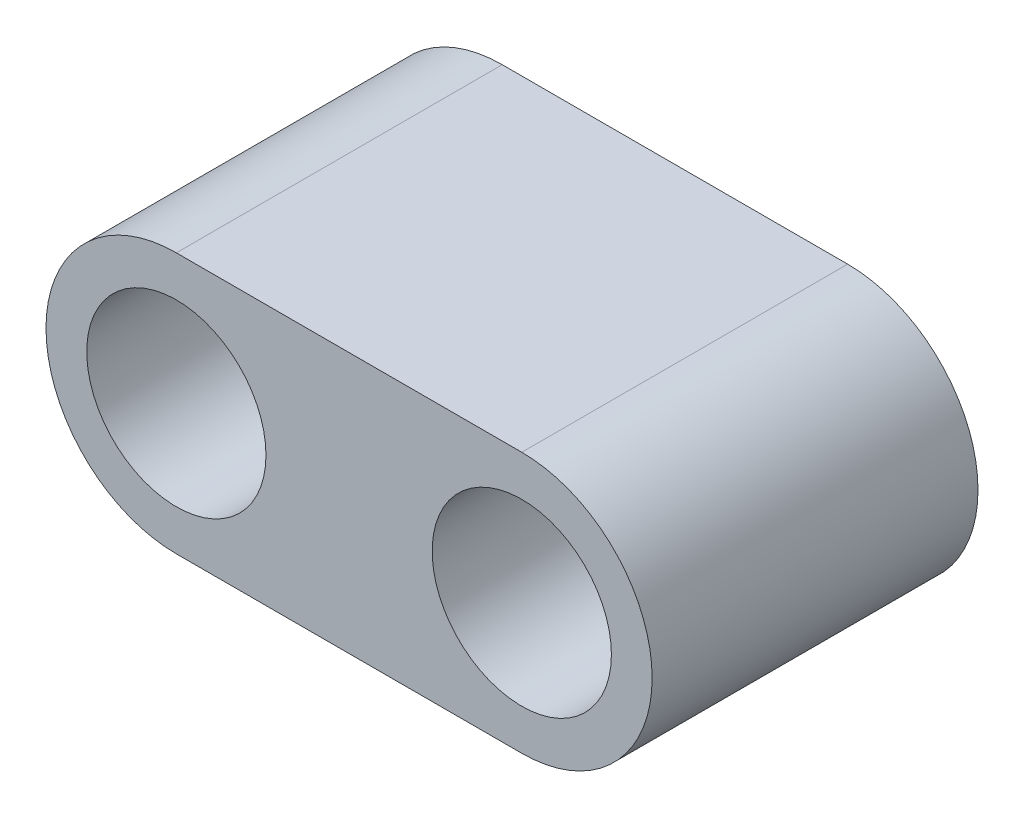
ISO-10303-21;
HEADER;
FILE_DESCRIPTION(('STEP AP214'),'2;1');
FILE_NAME('part.step','',(''),(''),'','','');
FILE_SCHEMA(('AUTOMOTIVE_DESIGN { 1 0 10303 214 1 1 1 1 }'));
ENDSEC;
DATA;
#1=APPLICATION_CONTEXT('core data for automotive mechanical design processes');
#2=APPLICATION_PROTOCOL_DEFINITION('international standard','automotive_design',2000,#1);
#3=PRODUCT_CONTEXT('',#1,'mechanical');
#4=PRODUCT('Part','Part','',(#3));
#5=PRODUCT_RELATED_PRODUCT_CATEGORY('part','',(#4));
#6=PRODUCT_DEFINITION_FORMATION('','',#4);
#7=PRODUCT_DEFINITION_CONTEXT('part definition',#1,'design');
#8=PRODUCT_DEFINITION('design','',#6,#7);
#9=PRODUCT_DEFINITION_SHAPE('','',#8);
#10=(LENGTH_UNIT() NAMED_UNIT(*) SI_UNIT(.MILLI.,.METRE.));
#11=(NAMED_UNIT(*) PLANE_ANGLE_UNIT() SI_UNIT($,.RADIAN.));
#12=(NAMED_UNIT(*) SI_UNIT($,.STERADIAN.) SOLID_ANGLE_UNIT());
#13=UNCERTAINTY_MEASURE_WITH_UNIT(LENGTH_MEASURE(1.E-05),#10,'distance_accuracy_value','');
#14=(GEOMETRIC_REPRESENTATION_CONTEXT(3) GLOBAL_UNCERTAINTY_ASSIGNED_CONTEXT((#13)) GLOBAL_UNIT_ASSIGNED_CONTEXT((#10,
#11,#12)) REPRESENTATION_CONTEXT('',''));
#15=CARTESIAN_POINT('',(0.,0.,0.));
#16=DIRECTION('',(0.,0.,1.));
#17=DIRECTION('',(1.,0.,0.));
#18=AXIS2_PLACEMENT_3D('',#15,#16,#17);
#19=CARTESIAN_POINT('',(0.,-10.,25.));
#20=DIRECTION('',(0.,0.,-1.));
#21=DIRECTION('',(-1.,0.,0.));
#22=AXIS2_PLACEMENT_3D('',#19,#20,#21);
#23=CYLINDRICAL_SURFACE('',#22,10.);
#24=CARTESIAN_POINT('',(0.,-10.,0.));
#25=DIRECTION('',(0.,0.,1.));
#26=DIRECTION('',(1.,0.,0.));
#27=AXIS2_PLACEMENT_3D('',#24,#25,#26);
#28=CIRCLE('',#27,10.);
#29=CARTESIAN_POINT('',(0.,0.,0.));
#30=VERTEX_POINT('',#29);
#31=CARTESIAN_POINT('',(0.,-20.,0.));
#32=VERTEX_POINT('',#31);
#33=EDGE_CURVE('E96',#30,#32,#28,.T.);
#34=ORIENTED_EDGE('',*,*,#33,.T.);
#35=DIRECTION('',(0.,0.,-1.));
#36=VECTOR('',#35,1.);
#37=CARTESIAN_POINT('',(0.,-20.,25.));
#38=LINE('',#37,#36);
#39=CARTESIAN_POINT('',(0.,-20.,25.));
#40=VERTEX_POINT('',#39);
#41=EDGE_CURVE('E11',#40,#32,#38,.T.);
#42=ORIENTED_EDGE('',*,*,#41,.F.);
#43=CARTESIAN_POINT('',(0.,-10.,25.));
#44=DIRECTION('',(0.,0.,1.));
#45=DIRECTION('',(1.,0.,0.));
#46=AXIS2_PLACEMENT_3D('',#43,#44,#45);
#47=CIRCLE('',#46,10.);
#48=CARTESIAN_POINT('',(0.,0.,25.));
#49=VERTEX_POINT('',#48);
#50=EDGE_CURVE('E84',#49,#40,#47,.T.);
#51=ORIENTED_EDGE('',*,*,#50,.F.);
#52=DIRECTION('',(0.,0.,-1.));
#53=VECTOR('',#52,1.);
#54=CARTESIAN_POINT('',(0.,0.,25.));
#55=LINE('',#54,#53);
#56=EDGE_CURVE('E92',#49,#30,#55,.T.);
#57=ORIENTED_EDGE('',*,*,#56,.T.);
#58=EDGE_LOOP('',(#34,#42,#51,#57));
#59=FACE_BOUND('',#58,.T.);
#60=ADVANCED_FACE('F33',(#59),#23,.T.);
#61=CARTESIAN_POINT('',(0.,-20.,25.));
#62=DIRECTION('',(0.,1.,0.));
#63=DIRECTION('',(0.,0.,1.));
#64=AXIS2_PLACEMENT_3D('',#61,#62,#63);
#65=PLANE('',#64);
#66=DIRECTION('',(1.,0.,0.));
#67=VECTOR('',#66,1.);
#68=CARTESIAN_POINT('',(0.,-20.,0.));
#69=LINE('',#68,#67);
#70=CARTESIAN_POINT('',(26.5,-20.,0.));
#71=VERTEX_POINT('',#70);
#72=EDGE_CURVE('E88',#32,#71,#69,.T.);
#73=ORIENTED_EDGE('',*,*,#72,.T.);
#74=DIRECTION('',(0.,0.,-1.));
#75=VECTOR('',#74,1.);
#76=CARTESIAN_POINT('',(26.5,-20.,25.));
#77=LINE('',#76,#75);
#78=CARTESIAN_POINT('',(26.5,-20.,25.));
#79=VERTEX_POINT('',#78);
#80=EDGE_CURVE('E41',#79,#71,#77,.T.);
#81=ORIENTED_EDGE('',*,*,#80,.F.);
#82=DIRECTION('',(1.,0.,0.));
#83=VECTOR('',#82,1.);
#84=CARTESIAN_POINT('',(0.,-20.,25.));
#85=LINE('',#84,#83);
#86=EDGE_CURVE('E79',#40,#79,#85,.T.);
#87=ORIENTED_EDGE('',*,*,#86,.F.);
#88=ORIENTED_EDGE('',*,*,#41,.T.);
#89=EDGE_LOOP('',(#73,#81,#87,#88));
#90=FACE_BOUND('',#89,.T.);
#91=ADVANCED_FACE('F87',(#90),#65,.F.);
#92=CARTESIAN_POINT('',(26.5,-10.,25.));
#93=DIRECTION('',(0.,0.,-1.));
#94=DIRECTION('',(-1.,0.,0.));
#95=AXIS2_PLACEMENT_3D('',#92,#93,#94);
#96=CYLINDRICAL_SURFACE('',#95,10.);
#97=CARTESIAN_POINT('',(26.5,-10.,0.));
#98=DIRECTION('',(0.,0.,1.));
#99=DIRECTION('',(-1.,0.,0.));
#100=AXIS2_PLACEMENT_3D('',#97,#98,#99);
#101=CIRCLE('',#100,10.);
#102=CARTESIAN_POINT('',(26.5,0.,0.));
#103=VERTEX_POINT('',#102);
#104=EDGE_CURVE('E66',#71,#103,#101,.T.);
#105=ORIENTED_EDGE('',*,*,#104,.T.);
#106=DIRECTION('',(0.,0.,-1.));
#107=VECTOR('',#106,1.);
#108=CARTESIAN_POINT('',(26.5,0.,25.));
#109=LINE('',#108,#107);
#110=CARTESIAN_POINT('',(26.5,0.,25.));
#111=VERTEX_POINT('',#110);
#112=EDGE_CURVE('E89',#111,#103,#109,.T.);
#113=ORIENTED_EDGE('',*,*,#112,.F.);
#114=CARTESIAN_POINT('',(26.5,-10.,25.));
#115=DIRECTION('',(0.,0.,1.));
#116=DIRECTION('',(-1.,0.,0.));
#117=AXIS2_PLACEMENT_3D('',#114,#115,#116);
#118=CIRCLE('',#117,10.);
#119=EDGE_CURVE('E82',#79,#111,#118,.T.);
#120=ORIENTED_EDGE('',*,*,#119,.F.);
#121=ORIENTED_EDGE('',*,*,#80,.T.);
#122=EDGE_LOOP('',(#105,#113,#120,#121));
#123=FACE_BOUND('',#122,.T.);
#124=ADVANCED_FACE('F90',(#123),#96,.T.);
#125=CARTESIAN_POINT('',(0.,0.,25.));
#126=DIRECTION('',(0.,-1.,0.));
#127=DIRECTION('',(0.,0.,-1.));
#128=AXIS2_PLACEMENT_3D('',#125,#126,#127);
#129=PLANE('',#128);
#130=DIRECTION('',(-1.,0.,0.));
#131=VECTOR('',#130,1.);
#132=CARTESIAN_POINT('',(0.,0.,0.));
#133=LINE('',#132,#131);
#134=EDGE_CURVE('E72',#103,#30,#133,.T.);
#135=ORIENTED_EDGE('',*,*,#134,.T.);
#136=ORIENTED_EDGE('',*,*,#56,.F.);
#137=DIRECTION('',(-1.,0.,0.));
#138=VECTOR('',#137,1.);
#139=CARTESIAN_POINT('',(0.,0.,25.));
#140=LINE('',#139,#138);
#141=EDGE_CURVE('E49',#111,#49,#140,.T.);
#142=ORIENTED_EDGE('',*,*,#141,.F.);
#143=ORIENTED_EDGE('',*,*,#112,.T.);
#144=EDGE_LOOP('',(#135,#136,#142,#143));
#145=FACE_BOUND('',#144,.T.);
#146=ADVANCED_FACE('F104',(#145),#129,.F.);
#147=CARTESIAN_POINT('',(0.,-10.,25.));
#148=DIRECTION('',(0.,0.,1.));
#149=DIRECTION('',(1.,0.,0.));
#150=AXIS2_PLACEMENT_3D('',#147,#148,#149);
#151=PLANE('',#150);
#152=CARTESIAN_POINT('',(0.,-10.,25.));
#153=DIRECTION('',(0.,0.,1.));
#154=DIRECTION('',(1.,0.,0.));
#155=AXIS2_PLACEMENT_3D('',#152,#153,#154);
#156=CIRCLE('',#155,6.875);
#157=CARTESIAN_POINT('',(6.875,-10.,25.));
#158=VERTEX_POINT('',#157);
#159=EDGE_CURVE('E116',#158,#158,#156,.T.);
#160=ORIENTED_EDGE('',*,*,#159,.F.);
#161=EDGE_LOOP('',(#160));
#162=FACE_BOUND('',#161,.T.);
#163=CARTESIAN_POINT('',(26.5,-10.,25.));
#164=DIRECTION('',(0.,0.,1.));
#165=DIRECTION('',(1.,0.,0.));
#166=AXIS2_PLACEMENT_3D('',#163,#164,#165);
#167=CIRCLE('',#166,6.875);
#168=CARTESIAN_POINT('',(33.375,-10.,25.));
#169=VERTEX_POINT('',#168);
#170=EDGE_CURVE('E110',#169,#169,#167,.T.);
#171=ORIENTED_EDGE('',*,*,#170,.F.);
#172=EDGE_LOOP('',(#171));
#173=FACE_BOUND('',#172,.T.);
#174=ORIENTED_EDGE('',*,*,#50,.T.);
#175=ORIENTED_EDGE('',*,*,#86,.T.);
#176=ORIENTED_EDGE('',*,*,#119,.T.);
#177=ORIENTED_EDGE('',*,*,#141,.T.);
#178=EDGE_LOOP('',(#174,#175,#176,#177));
#179=FACE_BOUND('',#178,.T.);
#180=ADVANCED_FACE('F80',(#162,#173,#179),#151,.T.);
#181=CARTESIAN_POINT('',(0.,-10.,0.));
#182=DIRECTION('',(0.,0.,1.));
#183=DIRECTION('',(1.,0.,0.));
#184=AXIS2_PLACEMENT_3D('',#181,#182,#183);
#185=PLANE('',#184);
#186=CARTESIAN_POINT('',(0.,-10.,0.));
#187=DIRECTION('',(0.,0.,1.));
#188=DIRECTION('',(1.,0.,0.));
#189=AXIS2_PLACEMENT_3D('',#186,#187,#188);
#190=CIRCLE('',#189,6.875);
#191=CARTESIAN_POINT('',(6.875,-10.,0.));
#192=VERTEX_POINT('',#191);
#193=EDGE_CURVE('E99',#192,#192,#190,.T.);
#194=ORIENTED_EDGE('',*,*,#193,.T.);
#195=EDGE_LOOP('',(#194));
#196=FACE_BOUND('',#195,.T.);
#197=CARTESIAN_POINT('',(26.5,-10.,0.));
#198=DIRECTION('',(0.,0.,1.));
#199=DIRECTION('',(1.,0.,0.));
#200=AXIS2_PLACEMENT_3D('',#197,#198,#199);
#201=CIRCLE('',#200,6.875);
#202=CARTESIAN_POINT('',(33.375,-10.,0.));
#203=VERTEX_POINT('',#202);
#204=EDGE_CURVE('E113',#203,#203,#201,.T.);
#205=ORIENTED_EDGE('',*,*,#204,.T.);
#206=EDGE_LOOP('',(#205));
#207=FACE_BOUND('',#206,.T.);
#208=ORIENTED_EDGE('',*,*,#33,.F.);
#209=ORIENTED_EDGE('',*,*,#134,.F.);
#210=ORIENTED_EDGE('',*,*,#104,.F.);
#211=ORIENTED_EDGE('',*,*,#72,.F.);
#212=EDGE_LOOP('',(#208,#209,#210,#211));
#213=FACE_BOUND('',#212,.T.);
#214=ADVANCED_FACE('F107',(#196,#207,#213),#185,.F.);
#215=CARTESIAN_POINT('',(26.5,-10.,0.));
#216=DIRECTION('',(0.,0.,1.));
#217=DIRECTION('',(1.,0.,0.));
#218=AXIS2_PLACEMENT_3D('',#215,#216,#217);
#219=CYLINDRICAL_SURFACE('',#218,6.875);
#220=ORIENTED_EDGE('',*,*,#204,.F.);
#221=EDGE_LOOP('',(#220));
#222=FACE_BOUND('',#221,.T.);
#223=ORIENTED_EDGE('',*,*,#170,.T.);
#224=EDGE_LOOP('',(#223));
#225=FACE_BOUND('',#224,.T.);
#226=ADVANCED_FACE('F127',(#222,#225),#219,.F.);
#227=CARTESIAN_POINT('',(0.,-10.,0.));
#228=DIRECTION('',(0.,0.,1.));
#229=DIRECTION('',(1.,0.,0.));
#230=AXIS2_PLACEMENT_3D('',#227,#228,#229);
#231=CYLINDRICAL_SURFACE('',#230,6.875);
#232=ORIENTED_EDGE('',*,*,#193,.F.);
#233=EDGE_LOOP('',(#232));
#234=FACE_BOUND('',#233,.T.);
#235=ORIENTED_EDGE('',*,*,#159,.T.);
#236=EDGE_LOOP('',(#235));
#237=FACE_BOUND('',#236,.T.);
#238=ADVANCED_FACE('F124',(#234,#237),#231,.F.);
#239=CLOSED_SHELL('',(#60,#91,#124,#146,#180,#214,#226,#238));
#240=MANIFOLD_SOLID_BREP('B2',#239);
#241=ADVANCED_BREP_SHAPE_REPRESENTATION('',(#18,#240),#14);
#242=SHAPE_DEFINITION_REPRESENTATION(#9,#241);
ENDSEC;
END-ISO-10303-21;
